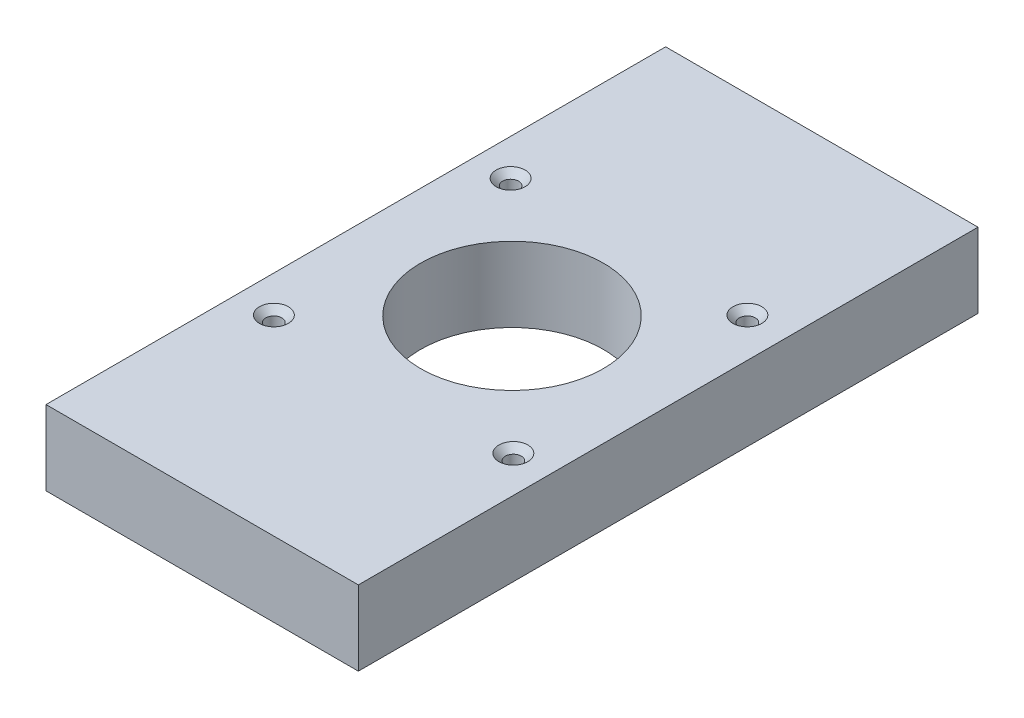
ISO-10303-21;
HEADER;
FILE_DESCRIPTION(('STEP AP214'),'2;1');
FILE_NAME('part.step','',(''),(''),'','','');
FILE_SCHEMA(('AUTOMOTIVE_DESIGN { 1 0 10303 214 1 1 1 1 }'));
ENDSEC;
DATA;
#1=APPLICATION_CONTEXT('core data for automotive mechanical design processes');
#2=APPLICATION_PROTOCOL_DEFINITION('international standard','automotive_design',2000,#1);
#3=PRODUCT_CONTEXT('',#1,'mechanical');
#4=PRODUCT('Part','Part','',(#3));
#5=PRODUCT_RELATED_PRODUCT_CATEGORY('part','',(#4));
#6=PRODUCT_DEFINITION_FORMATION('','',#4);
#7=PRODUCT_DEFINITION_CONTEXT('part definition',#1,'design');
#8=PRODUCT_DEFINITION('design','',#6,#7);
#9=PRODUCT_DEFINITION_SHAPE('','',#8);
#10=(LENGTH_UNIT() NAMED_UNIT(*) SI_UNIT(.MILLI.,.METRE.));
#11=(NAMED_UNIT(*) PLANE_ANGLE_UNIT() SI_UNIT($,.RADIAN.));
#12=(NAMED_UNIT(*) SI_UNIT($,.STERADIAN.) SOLID_ANGLE_UNIT());
#13=UNCERTAINTY_MEASURE_WITH_UNIT(LENGTH_MEASURE(1.E-05),#10,'distance_accuracy_value','');
#14=(GEOMETRIC_REPRESENTATION_CONTEXT(3) GLOBAL_UNCERTAINTY_ASSIGNED_CONTEXT((#13)) GLOBAL_UNIT_ASSIGNED_CONTEXT((#10,
#11,#12)) REPRESENTATION_CONTEXT('',''));
#15=CARTESIAN_POINT('',(0.,0.,0.));
#16=DIRECTION('',(0.,0.,1.));
#17=DIRECTION('',(1.,0.,0.));
#18=AXIS2_PLACEMENT_3D('',#15,#16,#17);
#19=CARTESIAN_POINT('',(15.41526,7.37616,30.57906));
#20=DIRECTION('',(-1.,0.,0.));
#21=DIRECTION('',(0.,0.,1.));
#22=AXIS2_PLACEMENT_3D('',#19,#20,#21);
#23=PLANE('',#22);
#24=DIRECTION('',(0.,0.,-1.));
#25=VECTOR('',#24,1.);
#26=CARTESIAN_POINT('',(15.41526,0.,30.57906));
#27=LINE('',#26,#25);
#28=CARTESIAN_POINT('',(15.41526,0.,30.57906));
#29=VERTEX_POINT('',#28);
#30=CARTESIAN_POINT('',(15.41526,0.,-30.57906));
#31=VERTEX_POINT('',#30);
#32=EDGE_CURVE('E98',#29,#31,#27,.T.);
#33=ORIENTED_EDGE('',*,*,#32,.T.);
#34=DIRECTION('',(0.,-1.,0.));
#35=VECTOR('',#34,1.);
#36=CARTESIAN_POINT('',(15.41526,7.37616,-30.57906));
#37=LINE('',#36,#35);
#38=CARTESIAN_POINT('',(15.41526,7.37616,-30.57906));
#39=VERTEX_POINT('',#38);
#40=EDGE_CURVE('E11',#39,#31,#37,.T.);
#41=ORIENTED_EDGE('',*,*,#40,.F.);
#42=DIRECTION('',(0.,0.,-1.));
#43=VECTOR('',#42,1.);
#44=CARTESIAN_POINT('',(15.41526,7.37616,30.57906));
#45=LINE('',#44,#43);
#46=CARTESIAN_POINT('',(15.41526,7.37616,30.57906));
#47=VERTEX_POINT('',#46);
#48=EDGE_CURVE('E86',#47,#39,#45,.T.);
#49=ORIENTED_EDGE('',*,*,#48,.F.);
#50=DIRECTION('',(0.,-1.,0.));
#51=VECTOR('',#50,1.);
#52=CARTESIAN_POINT('',(15.41526,7.37616,30.57906));
#53=LINE('',#52,#51);
#54=EDGE_CURVE('E94',#47,#29,#53,.T.);
#55=ORIENTED_EDGE('',*,*,#54,.T.);
#56=EDGE_LOOP('',(#33,#41,#49,#55));
#57=FACE_BOUND('',#56,.T.);
#58=ADVANCED_FACE('F35',(#57),#23,.F.);
#59=CARTESIAN_POINT('',(-15.41526,7.37616,-30.57906));
#60=DIRECTION('',(0.,0.,1.));
#61=DIRECTION('',(1.,0.,0.));
#62=AXIS2_PLACEMENT_3D('',#59,#60,#61);
#63=PLANE('',#62);
#64=DIRECTION('',(-1.,0.,0.));
#65=VECTOR('',#64,1.);
#66=CARTESIAN_POINT('',(-15.41526,0.,-30.57906));
#67=LINE('',#66,#65);
#68=CARTESIAN_POINT('',(-15.41526,0.,-30.57906));
#69=VERTEX_POINT('',#68);
#70=EDGE_CURVE('E90',#31,#69,#67,.T.);
#71=ORIENTED_EDGE('',*,*,#70,.T.);
#72=DIRECTION('',(0.,-1.,0.));
#73=VECTOR('',#72,1.);
#74=CARTESIAN_POINT('',(-15.41526,7.37616,-30.57906));
#75=LINE('',#74,#73);
#76=CARTESIAN_POINT('',(-15.41526,7.37616,-30.57906));
#77=VERTEX_POINT('',#76);
#78=EDGE_CURVE('E43',#77,#69,#75,.T.);
#79=ORIENTED_EDGE('',*,*,#78,.F.);
#80=DIRECTION('',(-1.,0.,0.));
#81=VECTOR('',#80,1.);
#82=CARTESIAN_POINT('',(-15.41526,7.37616,-30.57906));
#83=LINE('',#82,#81);
#84=EDGE_CURVE('E81',#39,#77,#83,.T.);
#85=ORIENTED_EDGE('',*,*,#84,.F.);
#86=ORIENTED_EDGE('',*,*,#40,.T.);
#87=EDGE_LOOP('',(#71,#79,#85,#86));
#88=FACE_BOUND('',#87,.T.);
#89=ADVANCED_FACE('F89',(#88),#63,.F.);
#90=CARTESIAN_POINT('',(-15.41526,7.37616,30.57906));
#91=DIRECTION('',(1.,0.,0.));
#92=DIRECTION('',(0.,0.,-1.));
#93=AXIS2_PLACEMENT_3D('',#90,#91,#92);
#94=PLANE('',#93);
#95=DIRECTION('',(0.,0.,1.));
#96=VECTOR('',#95,1.);
#97=CARTESIAN_POINT('',(-15.41526,0.,30.57906));
#98=LINE('',#97,#96);
#99=CARTESIAN_POINT('',(-15.41526,0.,30.57906));
#100=VERTEX_POINT('',#99);
#101=EDGE_CURVE('E68',#69,#100,#98,.T.);
#102=ORIENTED_EDGE('',*,*,#101,.T.);
#103=DIRECTION('',(0.,-1.,0.));
#104=VECTOR('',#103,1.);
#105=CARTESIAN_POINT('',(-15.41526,7.37616,30.57906));
#106=LINE('',#105,#104);
#107=CARTESIAN_POINT('',(-15.41526,7.37616,30.57906));
#108=VERTEX_POINT('',#107);
#109=EDGE_CURVE('E91',#108,#100,#106,.T.);
#110=ORIENTED_EDGE('',*,*,#109,.F.);
#111=DIRECTION('',(0.,0.,1.));
#112=VECTOR('',#111,1.);
#113=CARTESIAN_POINT('',(-15.41526,7.37616,30.57906));
#114=LINE('',#113,#112);
#115=EDGE_CURVE('E84',#77,#108,#114,.T.);
#116=ORIENTED_EDGE('',*,*,#115,.F.);
#117=ORIENTED_EDGE('',*,*,#78,.T.);
#118=EDGE_LOOP('',(#102,#110,#116,#117));
#119=FACE_BOUND('',#118,.T.);
#120=ADVANCED_FACE('F92',(#119),#94,.F.);
#121=CARTESIAN_POINT('',(-15.41526,7.37616,30.57906));
#122=DIRECTION('',(0.,0.,-1.));
#123=DIRECTION('',(-1.,0.,0.));
#124=AXIS2_PLACEMENT_3D('',#121,#122,#123);
#125=PLANE('',#124);
#126=DIRECTION('',(1.,0.,0.));
#127=VECTOR('',#126,1.);
#128=CARTESIAN_POINT('',(-15.41526,0.,30.57906));
#129=LINE('',#128,#127);
#130=EDGE_CURVE('E74',#100,#29,#129,.T.);
#131=ORIENTED_EDGE('',*,*,#130,.T.);
#132=ORIENTED_EDGE('',*,*,#54,.F.);
#133=DIRECTION('',(1.,0.,0.));
#134=VECTOR('',#133,1.);
#135=CARTESIAN_POINT('',(-15.41526,7.37616,30.57906));
#136=LINE('',#135,#134);
#137=EDGE_CURVE('E51',#108,#47,#136,.T.);
#138=ORIENTED_EDGE('',*,*,#137,.F.);
#139=ORIENTED_EDGE('',*,*,#109,.T.);
#140=EDGE_LOOP('',(#131,#132,#138,#139));
#141=FACE_BOUND('',#140,.T.);
#142=ADVANCED_FACE('F106',(#141),#125,.F.);
#143=CARTESIAN_POINT('',(0.,7.37616,0.));
#144=DIRECTION('',(0.,-1.,0.));
#145=DIRECTION('',(0.,0.,-1.));
#146=AXIS2_PLACEMENT_3D('',#143,#144,#145);
#147=PLANE('',#146);
#148=CARTESIAN_POINT('',(-11.81862,7.37616,-11.684));
#149=DIRECTION('',(0.,1.,0.));
#150=DIRECTION('',(0.,0.,1.));
#151=AXIS2_PLACEMENT_3D('',#148,#149,#150);
#152=CIRCLE('',#151,1.42875);
#153=CARTESIAN_POINT('',(-11.81862,7.37616,-10.25525));
#154=VERTEX_POINT('',#153);
#155=EDGE_CURVE('E150',#154,#154,#152,.T.);
#156=ORIENTED_EDGE('',*,*,#155,.F.);
#157=EDGE_LOOP('',(#156));
#158=FACE_BOUND('',#157,.T.);
#159=CARTESIAN_POINT('',(11.54938,7.37616,-11.684));
#160=DIRECTION('',(0.,1.,0.));
#161=DIRECTION('',(0.,0.,1.));
#162=AXIS2_PLACEMENT_3D('',#159,#160,#161);
#163=CIRCLE('',#162,1.42875);
#164=CARTESIAN_POINT('',(11.54938,7.37616,-10.25525));
#165=VERTEX_POINT('',#164);
#166=EDGE_CURVE('E141',#165,#165,#163,.T.);
#167=ORIENTED_EDGE('',*,*,#166,.F.);
#168=EDGE_LOOP('',(#167));
#169=FACE_BOUND('',#168,.T.);
#170=CARTESIAN_POINT('',(11.81862,7.37616,11.684));
#171=DIRECTION('',(0.,1.,0.));
#172=DIRECTION('',(0.,0.,1.));
#173=AXIS2_PLACEMENT_3D('',#170,#171,#172);
#174=CIRCLE('',#173,1.42875);
#175=CARTESIAN_POINT('',(11.81862,7.37616,13.11275));
#176=VERTEX_POINT('',#175);
#177=EDGE_CURVE('E132',#176,#176,#174,.T.);
#178=ORIENTED_EDGE('',*,*,#177,.F.);
#179=EDGE_LOOP('',(#178));
#180=FACE_BOUND('',#179,.T.);
#181=CARTESIAN_POINT('',(-11.81862,7.37616,11.684));
#182=DIRECTION('',(0.,1.,0.));
#183=DIRECTION('',(0.,0.,1.));
#184=AXIS2_PLACEMENT_3D('',#181,#182,#183);
#185=CIRCLE('',#184,1.42875);
#186=CARTESIAN_POINT('',(-11.81862,7.37616,13.11275));
#187=VERTEX_POINT('',#186);
#188=EDGE_CURVE('E123',#187,#187,#185,.T.);
#189=ORIENTED_EDGE('',*,*,#188,.F.);
#190=EDGE_LOOP('',(#189));
#191=FACE_BOUND('',#190,.T.);
#192=CARTESIAN_POINT('',(0.,7.37616,0.));
#193=DIRECTION('',(0.,1.,0.));
#194=DIRECTION('',(0.,0.,1.));
#195=AXIS2_PLACEMENT_3D('',#192,#193,#194);
#196=CIRCLE('',#195,9.02208);
#197=CARTESIAN_POINT('',(0.,7.37616,9.02208));
#198=VERTEX_POINT('',#197);
#199=EDGE_CURVE('E112',#198,#198,#196,.T.);
#200=ORIENTED_EDGE('',*,*,#199,.F.);
#201=EDGE_LOOP('',(#200));
#202=FACE_BOUND('',#201,.T.);
#203=ORIENTED_EDGE('',*,*,#48,.T.);
#204=ORIENTED_EDGE('',*,*,#84,.T.);
#205=ORIENTED_EDGE('',*,*,#115,.T.);
#206=ORIENTED_EDGE('',*,*,#137,.T.);
#207=EDGE_LOOP('',(#203,#204,#205,#206));
#208=FACE_BOUND('',#207,.T.);
#209=ADVANCED_FACE('F82',(#158,#169,#180,#191,#202,#208),#147,.F.);
#210=CARTESIAN_POINT('',(0.,0.,0.));
#211=DIRECTION('',(0.,-1.,0.));
#212=DIRECTION('',(0.,0.,-1.));
#213=AXIS2_PLACEMENT_3D('',#210,#211,#212);
#214=PLANE('',#213);
#215=CARTESIAN_POINT('',(-11.81862,0.,-11.684));
#216=DIRECTION('',(0.,1.,0.));
#217=DIRECTION('',(0.,0.,1.));
#218=AXIS2_PLACEMENT_3D('',#215,#216,#217);
#219=CIRCLE('',#218,0.793749999999998);
#220=CARTESIAN_POINT('',(-11.81862,0.,-10.89025));
#221=VERTEX_POINT('',#220);
#222=EDGE_CURVE('E144',#221,#221,#219,.T.);
#223=ORIENTED_EDGE('',*,*,#222,.T.);
#224=EDGE_LOOP('',(#223));
#225=FACE_BOUND('',#224,.T.);
#226=CARTESIAN_POINT('',(11.54938,0.,-11.684));
#227=DIRECTION('',(0.,1.,0.));
#228=DIRECTION('',(0.,0.,1.));
#229=AXIS2_PLACEMENT_3D('',#226,#227,#228);
#230=CIRCLE('',#229,0.793749999999998);
#231=CARTESIAN_POINT('',(11.54938,0.,-10.89025));
#232=VERTEX_POINT('',#231);
#233=EDGE_CURVE('E135',#232,#232,#230,.T.);
#234=ORIENTED_EDGE('',*,*,#233,.T.);
#235=EDGE_LOOP('',(#234));
#236=FACE_BOUND('',#235,.T.);
#237=CARTESIAN_POINT('',(11.81862,0.,11.684));
#238=DIRECTION('',(0.,1.,0.));
#239=DIRECTION('',(0.,0.,1.));
#240=AXIS2_PLACEMENT_3D('',#237,#238,#239);
#241=CIRCLE('',#240,0.793749999999998);
#242=CARTESIAN_POINT('',(11.81862,0.,12.47775));
#243=VERTEX_POINT('',#242);
#244=EDGE_CURVE('E126',#243,#243,#241,.T.);
#245=ORIENTED_EDGE('',*,*,#244,.T.);
#246=EDGE_LOOP('',(#245));
#247=FACE_BOUND('',#246,.T.);
#248=CARTESIAN_POINT('',(-11.81862,0.,11.684));
#249=DIRECTION('',(0.,1.,0.));
#250=DIRECTION('',(0.,0.,1.));
#251=AXIS2_PLACEMENT_3D('',#248,#249,#250);
#252=CIRCLE('',#251,0.793749999999998);
#253=CARTESIAN_POINT('',(-11.81862,0.,12.47775));
#254=VERTEX_POINT('',#253);
#255=EDGE_CURVE('E115',#254,#254,#252,.T.);
#256=ORIENTED_EDGE('',*,*,#255,.T.);
#257=EDGE_LOOP('',(#256));
#258=FACE_BOUND('',#257,.T.);
#259=CARTESIAN_POINT('',(0.,0.,0.));
#260=DIRECTION('',(0.,1.,0.));
#261=DIRECTION('',(0.,0.,1.));
#262=AXIS2_PLACEMENT_3D('',#259,#260,#261);
#263=CIRCLE('',#262,9.02208);
#264=CARTESIAN_POINT('',(0.,0.,9.02208));
#265=VERTEX_POINT('',#264);
#266=EDGE_CURVE('E101',#265,#265,#263,.T.);
#267=ORIENTED_EDGE('',*,*,#266,.T.);
#268=EDGE_LOOP('',(#267));
#269=FACE_BOUND('',#268,.T.);
#270=ORIENTED_EDGE('',*,*,#32,.F.);
#271=ORIENTED_EDGE('',*,*,#130,.F.);
#272=ORIENTED_EDGE('',*,*,#101,.F.);
#273=ORIENTED_EDGE('',*,*,#70,.F.);
#274=EDGE_LOOP('',(#270,#271,#272,#273));
#275=FACE_BOUND('',#274,.T.);
#276=ADVANCED_FACE('F109',(#225,#236,#247,#258,#269,#275),#214,.T.);
#277=CARTESIAN_POINT('',(0.,0.,0.));
#278=DIRECTION('',(0.,1.,0.));
#279=DIRECTION('',(0.,0.,1.));
#280=AXIS2_PLACEMENT_3D('',#277,#278,#279);
#281=CYLINDRICAL_SURFACE('',#280,9.02208);
#282=ORIENTED_EDGE('',*,*,#266,.F.);
#283=EDGE_LOOP('',(#282));
#284=FACE_BOUND('',#283,.T.);
#285=ORIENTED_EDGE('',*,*,#199,.T.);
#286=EDGE_LOOP('',(#285));
#287=FACE_BOUND('',#286,.T.);
#288=ADVANCED_FACE('F167',(#284,#287),#281,.F.);
#289=CARTESIAN_POINT('',(-11.81862,7.37616,11.684));
#290=DIRECTION('',(0.,1.,0.));
#291=DIRECTION('',(0.,0.,1.));
#292=AXIS2_PLACEMENT_3D('',#289,#290,#291);
#293=CYLINDRICAL_SURFACE('',#292,0.793749999999992);
#294=ORIENTED_EDGE('',*,*,#255,.F.);
#295=EDGE_LOOP('',(#294));
#296=FACE_BOUND('',#295,.T.);
#297=CARTESIAN_POINT('',(-11.81862,6.74115999999999,11.684));
#298=DIRECTION('',(0.,1.,0.));
#299=DIRECTION('',(0.,0.,1.));
#300=AXIS2_PLACEMENT_3D('',#297,#298,#299);
#301=CIRCLE('',#300,0.793749999999987);
#302=CARTESIAN_POINT('',(-11.81862,6.74115999999999,12.47775));
#303=VERTEX_POINT('',#302);
#304=EDGE_CURVE('E120',#303,#303,#301,.T.);
#305=ORIENTED_EDGE('',*,*,#304,.T.);
#306=EDGE_LOOP('',(#305));
#307=FACE_BOUND('',#306,.T.);
#308=ADVANCED_FACE('F169',(#296,#307),#293,.F.);
#309=CARTESIAN_POINT('',(-11.81862,7.37616,11.684));
#310=DIRECTION('',(0.,1.,0.));
#311=DIRECTION('',(0.,0.,1.));
#312=AXIS2_PLACEMENT_3D('',#309,#310,#311);
#313=CONICAL_SURFACE('',#312,1.42875,0.785398163397448);
#314=ORIENTED_EDGE('',*,*,#304,.F.);
#315=EDGE_LOOP('',(#314));
#316=FACE_BOUND('',#315,.T.);
#317=ORIENTED_EDGE('',*,*,#188,.T.);
#318=EDGE_LOOP('',(#317));
#319=FACE_BOUND('',#318,.T.);
#320=ADVANCED_FACE('F176',(#316,#319),#313,.F.);
#321=CARTESIAN_POINT('',(11.81862,7.37616,11.684));
#322=DIRECTION('',(0.,1.,0.));
#323=DIRECTION('',(0.,0.,1.));
#324=AXIS2_PLACEMENT_3D('',#321,#322,#323);
#325=CYLINDRICAL_SURFACE('',#324,0.793749999999992);
#326=ORIENTED_EDGE('',*,*,#244,.F.);
#327=EDGE_LOOP('',(#326));
#328=FACE_BOUND('',#327,.T.);
#329=CARTESIAN_POINT('',(11.81862,6.74115999999999,11.684));
#330=DIRECTION('',(0.,1.,0.));
#331=DIRECTION('',(0.,0.,1.));
#332=AXIS2_PLACEMENT_3D('',#329,#330,#331);
#333=CIRCLE('',#332,0.793749999999987);
#334=CARTESIAN_POINT('',(11.81862,6.74115999999999,12.47775));
#335=VERTEX_POINT('',#334);
#336=EDGE_CURVE('E129',#335,#335,#333,.T.);
#337=ORIENTED_EDGE('',*,*,#336,.T.);
#338=EDGE_LOOP('',(#337));
#339=FACE_BOUND('',#338,.T.);
#340=ADVANCED_FACE('F220',(#328,#339),#325,.F.);
#341=CARTESIAN_POINT('',(11.81862,7.37616,11.684));
#342=DIRECTION('',(0.,1.,0.));
#343=DIRECTION('',(0.,0.,1.));
#344=AXIS2_PLACEMENT_3D('',#341,#342,#343);
#345=CONICAL_SURFACE('',#344,1.42875,0.785398163397448);
#346=ORIENTED_EDGE('',*,*,#336,.F.);
#347=EDGE_LOOP('',(#346));
#348=FACE_BOUND('',#347,.T.);
#349=ORIENTED_EDGE('',*,*,#177,.T.);
#350=EDGE_LOOP('',(#349));
#351=FACE_BOUND('',#350,.T.);
#352=ADVANCED_FACE('F230',(#348,#351),#345,.F.);
#353=CARTESIAN_POINT('',(11.54938,7.37616,-11.684));
#354=DIRECTION('',(0.,1.,0.));
#355=DIRECTION('',(0.,0.,1.));
#356=AXIS2_PLACEMENT_3D('',#353,#354,#355);
#357=CYLINDRICAL_SURFACE('',#356,0.793749999999992);
#358=ORIENTED_EDGE('',*,*,#233,.F.);
#359=EDGE_LOOP('',(#358));
#360=FACE_BOUND('',#359,.T.);
#361=CARTESIAN_POINT('',(11.54938,6.74115999999999,-11.684));
#362=DIRECTION('',(0.,1.,0.));
#363=DIRECTION('',(0.,0.,1.));
#364=AXIS2_PLACEMENT_3D('',#361,#362,#363);
#365=CIRCLE('',#364,0.793749999999987);
#366=CARTESIAN_POINT('',(11.54938,6.74115999999999,-10.89025));
#367=VERTEX_POINT('',#366);
#368=EDGE_CURVE('E138',#367,#367,#365,.T.);
#369=ORIENTED_EDGE('',*,*,#368,.T.);
#370=EDGE_LOOP('',(#369));
#371=FACE_BOUND('',#370,.T.);
#372=ADVANCED_FACE('F240',(#360,#371),#357,.F.);
#373=CARTESIAN_POINT('',(11.54938,7.37616,-11.684));
#374=DIRECTION('',(0.,1.,0.));
#375=DIRECTION('',(0.,0.,1.));
#376=AXIS2_PLACEMENT_3D('',#373,#374,#375);
#377=CONICAL_SURFACE('',#376,1.42875,0.785398163397448);
#378=ORIENTED_EDGE('',*,*,#368,.F.);
#379=EDGE_LOOP('',(#378));
#380=FACE_BOUND('',#379,.T.);
#381=ORIENTED_EDGE('',*,*,#166,.T.);
#382=EDGE_LOOP('',(#381));
#383=FACE_BOUND('',#382,.T.);
#384=ADVANCED_FACE('F250',(#380,#383),#377,.F.);
#385=CARTESIAN_POINT('',(-11.81862,7.37616,-11.684));
#386=DIRECTION('',(0.,1.,0.));
#387=DIRECTION('',(0.,0.,1.));
#388=AXIS2_PLACEMENT_3D('',#385,#386,#387);
#389=CYLINDRICAL_SURFACE('',#388,0.793749999999992);
#390=ORIENTED_EDGE('',*,*,#222,.F.);
#391=EDGE_LOOP('',(#390));
#392=FACE_BOUND('',#391,.T.);
#393=CARTESIAN_POINT('',(-11.81862,6.74115999999999,-11.684));
#394=DIRECTION('',(0.,1.,0.));
#395=DIRECTION('',(0.,0.,1.));
#396=AXIS2_PLACEMENT_3D('',#393,#394,#395);
#397=CIRCLE('',#396,0.793749999999987);
#398=CARTESIAN_POINT('',(-11.81862,6.74115999999999,-10.89025));
#399=VERTEX_POINT('',#398);
#400=EDGE_CURVE('E147',#399,#399,#397,.T.);
#401=ORIENTED_EDGE('',*,*,#400,.T.);
#402=EDGE_LOOP('',(#401));
#403=FACE_BOUND('',#402,.T.);
#404=ADVANCED_FACE('F260',(#392,#403),#389,.F.);
#405=CARTESIAN_POINT('',(-11.81862,7.37616,-11.684));
#406=DIRECTION('',(0.,1.,0.));
#407=DIRECTION('',(0.,0.,1.));
#408=AXIS2_PLACEMENT_3D('',#405,#406,#407);
#409=CONICAL_SURFACE('',#408,1.42875,0.785398163397448);
#410=ORIENTED_EDGE('',*,*,#400,.F.);
#411=EDGE_LOOP('',(#410));
#412=FACE_BOUND('',#411,.T.);
#413=ORIENTED_EDGE('',*,*,#155,.T.);
#414=EDGE_LOOP('',(#413));
#415=FACE_BOUND('',#414,.T.);
#416=ADVANCED_FACE('F154',(#412,#415),#409,.F.);
#417=CLOSED_SHELL('',(#58,#89,#120,#142,#209,#276,#288,#308,#320,#340,#352,#372,#384,#404,#416));
#418=MANIFOLD_SOLID_BREP('B2',#417);
#419=ADVANCED_BREP_SHAPE_REPRESENTATION('',(#18,#418),#14);
#420=SHAPE_DEFINITION_REPRESENTATION(#9,#419);
ENDSEC;
END-ISO-10303-21;
